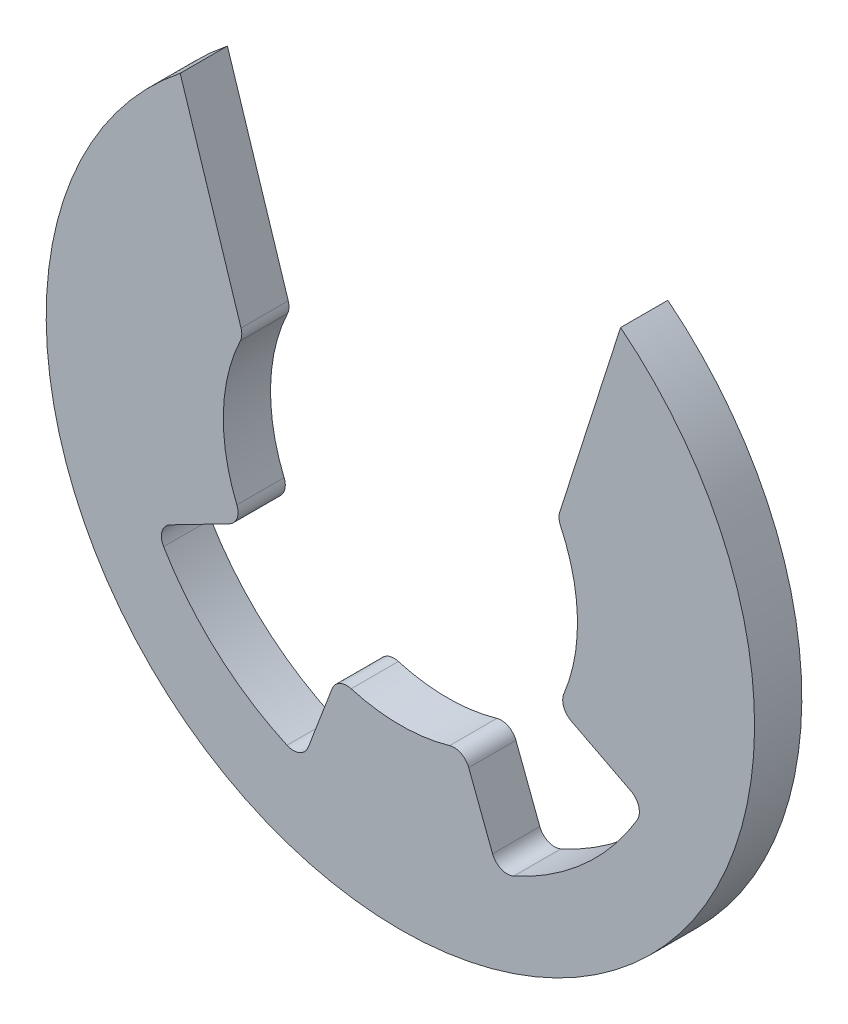
ISO-10303-21;
HEADER;
FILE_DESCRIPTION(('STEP AP214'),'2;1');
FILE_NAME('part.step','',(''),(''),'','','');
FILE_SCHEMA(('AUTOMOTIVE_DESIGN { 1 0 10303 214 1 1 1 1 }'));
ENDSEC;
DATA;
#1=APPLICATION_CONTEXT('core data for automotive mechanical design processes');
#2=APPLICATION_PROTOCOL_DEFINITION('international standard','automotive_design',2000,#1);
#3=PRODUCT_CONTEXT('',#1,'mechanical');
#4=PRODUCT('Part','Part','',(#3));
#5=PRODUCT_RELATED_PRODUCT_CATEGORY('part','',(#4));
#6=PRODUCT_DEFINITION_FORMATION('','',#4);
#7=PRODUCT_DEFINITION_CONTEXT('part definition',#1,'design');
#8=PRODUCT_DEFINITION('design','',#6,#7);
#9=PRODUCT_DEFINITION_SHAPE('','',#8);
#10=(LENGTH_UNIT() NAMED_UNIT(*) SI_UNIT(.MILLI.,.METRE.));
#11=(NAMED_UNIT(*) PLANE_ANGLE_UNIT() SI_UNIT($,.RADIAN.));
#12=(NAMED_UNIT(*) SI_UNIT($,.STERADIAN.) SOLID_ANGLE_UNIT());
#13=UNCERTAINTY_MEASURE_WITH_UNIT(LENGTH_MEASURE(1.E-05),#10,'distance_accuracy_value','');
#14=(GEOMETRIC_REPRESENTATION_CONTEXT(3) GLOBAL_UNCERTAINTY_ASSIGNED_CONTEXT((#13)) GLOBAL_UNIT_ASSIGNED_CONTEXT((#10,
#11,#12)) REPRESENTATION_CONTEXT('',''));
#15=CARTESIAN_POINT('',(0.,0.,0.));
#16=DIRECTION('',(0.,0.,1.));
#17=DIRECTION('',(1.,0.,0.));
#18=AXIS2_PLACEMENT_3D('',#15,#16,#17);
#19=CARTESIAN_POINT('',(2.21510509098527,1.04680916880353,0.6));
#20=DIRECTION('',(0.,0.,-1.));
#21=DIRECTION('',(-1.,0.,0.));
#22=AXIS2_PLACEMENT_3D('',#19,#20,#21);
#23=CYLINDRICAL_SURFACE('',#22,0.2);
#24=CARTESIAN_POINT('',(2.21510509098527,1.04680916880353,0.));
#25=DIRECTION('',(0.,0.,1.));
#26=DIRECTION('',(1.,0.,0.));
#27=AXIS2_PLACEMENT_3D('',#24,#25,#26);
#28=CIRCLE('',#27,0.2);
#29=CARTESIAN_POINT('',(2.02460886438716,1.1077286866273,0.));
#30=VERTEX_POINT('',#29);
#31=CARTESIAN_POINT('',(2.03428018559872,0.961355359105285,0.));
#32=VERTEX_POINT('',#31);
#33=EDGE_CURVE('E217',#30,#32,#28,.T.);
#34=ORIENTED_EDGE('',*,*,#33,.T.);
#35=DIRECTION('',(0.,0.,-1.));
#36=VECTOR('',#35,1.);
#37=CARTESIAN_POINT('',(2.03428018559872,0.961355359105285,0.6));
#38=LINE('',#37,#36);
#39=CARTESIAN_POINT('',(2.03428018559872,0.961355359105285,0.6));
#40=VERTEX_POINT('',#39);
#41=EDGE_CURVE('E11',#40,#32,#38,.T.);
#42=ORIENTED_EDGE('',*,*,#41,.F.);
#43=CARTESIAN_POINT('',(2.21510509098527,1.04680916880353,0.6));
#44=DIRECTION('',(0.,0.,1.));
#45=DIRECTION('',(1.,0.,0.));
#46=AXIS2_PLACEMENT_3D('',#43,#44,#45);
#47=CIRCLE('',#46,0.2);
#48=CARTESIAN_POINT('',(2.02460886438716,1.1077286866273,0.6));
#49=VERTEX_POINT('',#48);
#50=EDGE_CURVE('E259',#49,#40,#47,.T.);
#51=ORIENTED_EDGE('',*,*,#50,.F.);
#52=DIRECTION('',(0.,0.,-1.));
#53=VECTOR('',#52,1.);
#54=CARTESIAN_POINT('',(2.02460886438716,1.1077286866273,0.6));
#55=LINE('',#54,#53);
#56=EDGE_CURVE('E213',#49,#30,#55,.T.);
#57=ORIENTED_EDGE('',*,*,#56,.T.);
#58=EDGE_LOOP('',(#34,#42,#51,#57));
#59=FACE_BOUND('',#58,.T.);
#60=ADVANCED_FACE('F37',(#59),#23,.T.);
#61=CARTESIAN_POINT('',(0.,0.,0.6));
#62=DIRECTION('',(0.,0.,-1.));
#63=DIRECTION('',(-1.,0.,0.));
#64=AXIS2_PLACEMENT_3D('',#61,#62,#63);
#65=CYLINDRICAL_SURFACE('',#64,2.25);
#66=CARTESIAN_POINT('',(0.,0.,0.));
#67=DIRECTION('',(0.,0.,-1.));
#68=DIRECTION('',(1.,0.,0.));
#69=AXIS2_PLACEMENT_3D('',#66,#67,#68);
#70=CIRCLE('',#69,2.25);
#71=CARTESIAN_POINT('',(2.07746998371869,-0.864070869054071,0.));
#72=VERTEX_POINT('',#71);
#73=EDGE_CURVE('E220',#32,#72,#70,.T.);
#74=ORIENTED_EDGE('',*,*,#73,.T.);
#75=DIRECTION('',(0.,0.,-1.));
#76=VECTOR('',#75,1.);
#77=CARTESIAN_POINT('',(2.07746998371869,-0.864070869054071,0.6));
#78=LINE('',#77,#76);
#79=CARTESIAN_POINT('',(2.07746998371869,-0.864070869054071,0.6));
#80=VERTEX_POINT('',#79);
#81=EDGE_CURVE('E45',#80,#72,#78,.T.);
#82=ORIENTED_EDGE('',*,*,#81,.F.);
#83=CARTESIAN_POINT('',(0.,0.,0.6));
#84=DIRECTION('',(0.,0.,-1.));
#85=DIRECTION('',(1.,0.,0.));
#86=AXIS2_PLACEMENT_3D('',#83,#84,#85);
#87=CIRCLE('',#86,2.25);
#88=EDGE_CURVE('E138',#40,#80,#87,.T.);
#89=ORIENTED_EDGE('',*,*,#88,.F.);
#90=ORIENTED_EDGE('',*,*,#41,.T.);
#91=EDGE_LOOP('',(#74,#82,#89,#90));
#92=FACE_BOUND('',#91,.T.);
#93=ADVANCED_FACE('F387',(#92),#65,.F.);
#94=CARTESIAN_POINT('',(2.26213398227146,-0.940877168525544,0.6));
#95=DIRECTION('',(0.,0.,-1.));
#96=DIRECTION('',(-1.,0.,0.));
#97=AXIS2_PLACEMENT_3D('',#94,#95,#96);
#98=CYLINDRICAL_SURFACE('',#97,0.2);
#99=CARTESIAN_POINT('',(2.26213398227146,-0.940877168525544,0.));
#100=DIRECTION('',(0.,0.,1.));
#101=DIRECTION('',(-1.,0.,0.));
#102=AXIS2_PLACEMENT_3D('',#99,#100,#101);
#103=CIRCLE('',#102,0.2);
#104=CARTESIAN_POINT('',(2.17050941281329,-1.11865494630332,0.));
#105=VERTEX_POINT('',#104);
#106=EDGE_CURVE('E222',#72,#105,#103,.T.);
#107=ORIENTED_EDGE('',*,*,#106,.T.);
#108=DIRECTION('',(0.,0.,-1.));
#109=VECTOR('',#108,1.);
#110=CARTESIAN_POINT('',(2.17050941281329,-1.11865494630332,0.6));
#111=LINE('',#110,#109);
#112=CARTESIAN_POINT('',(2.17050941281329,-1.11865494630332,0.6));
#113=VERTEX_POINT('',#112);
#114=EDGE_CURVE('E308',#113,#105,#111,.T.);
#115=ORIENTED_EDGE('',*,*,#114,.F.);
#116=CARTESIAN_POINT('',(2.26213398227146,-0.940877168525544,0.6));
#117=DIRECTION('',(0.,0.,1.));
#118=DIRECTION('',(-1.,0.,0.));
#119=AXIS2_PLACEMENT_3D('',#116,#117,#118);
#120=CIRCLE('',#119,0.2);
#121=EDGE_CURVE('E316',#80,#113,#120,.T.);
#122=ORIENTED_EDGE('',*,*,#121,.F.);
#123=ORIENTED_EDGE('',*,*,#81,.T.);
#124=EDGE_LOOP('',(#107,#115,#122,#123));
#125=FACE_BOUND('',#124,.T.);
#126=ADVANCED_FACE('F314',(#125),#98,.T.);
#127=CARTESIAN_POINT('',(2.17050941281329,-1.11865494630332,0.6));
#128=DIRECTION('',(0.458122847290851,0.888888888888889,0.));
#129=DIRECTION('',(-0.888888888888889,0.458122847290851,0.));
#130=AXIS2_PLACEMENT_3D('',#127,#128,#129);
#131=PLANE('',#130);
#132=DIRECTION('',(0.888888888888889,-0.458122847290851,0.));
#133=VECTOR('',#132,1.);
#134=CARTESIAN_POINT('',(2.17050941281329,-1.11865494630332,0.));
#135=LINE('',#134,#133);
#136=CARTESIAN_POINT('',(2.92794117191122,-1.50902633967309,0.));
#137=VERTEX_POINT('',#136);
#138=EDGE_CURVE('E224',#105,#137,#135,.T.);
#139=ORIENTED_EDGE('',*,*,#138,.T.);
#140=DIRECTION('',(0.,0.,-1.));
#141=VECTOR('',#140,1.);
#142=CARTESIAN_POINT('',(2.92794117191122,-1.50902633967309,0.6));
#143=LINE('',#142,#141);
#144=CARTESIAN_POINT('',(2.92794117191122,-1.50902633967309,0.6));
#145=VERTEX_POINT('',#144);
#146=EDGE_CURVE('E305',#145,#137,#143,.T.);
#147=ORIENTED_EDGE('',*,*,#146,.F.);
#148=DIRECTION('',(0.888888888888889,-0.458122847290851,0.));
#149=VECTOR('',#148,1.);
#150=CARTESIAN_POINT('',(2.17050941281329,-1.11865494630332,0.6));
#151=LINE('',#150,#149);
#152=EDGE_CURVE('E334',#113,#145,#151,.T.);
#153=ORIENTED_EDGE('',*,*,#152,.F.);
#154=ORIENTED_EDGE('',*,*,#114,.T.);
#155=EDGE_LOOP('',(#139,#147,#153,#154));
#156=FACE_BOUND('',#155,.T.);
#157=ADVANCED_FACE('F325',(#156),#131,.F.);
#158=CARTESIAN_POINT('',(2.83631660245305,-1.68680411745087,0.6));
#159=DIRECTION('',(0.,0.,-1.));
#160=DIRECTION('',(-1.,0.,0.));
#161=AXIS2_PLACEMENT_3D('',#158,#159,#160);
#162=CYLINDRICAL_SURFACE('',#161,0.2);
#163=CARTESIAN_POINT('',(2.83631660245305,-1.68680411745087,0.));
#164=DIRECTION('',(0.,0.,-1.));
#165=DIRECTION('',(-1.,0.,0.));
#166=AXIS2_PLACEMENT_3D('',#163,#164,#165);
#167=CIRCLE('',#166,0.2);
#168=CARTESIAN_POINT('',(3.00821457835929,-1.78903467002365,0.));
#169=VERTEX_POINT('',#168);
#170=EDGE_CURVE('E226',#137,#169,#167,.T.);
#171=ORIENTED_EDGE('',*,*,#170,.T.);
#172=DIRECTION('',(0.,0.,-1.));
#173=VECTOR('',#172,1.);
#174=CARTESIAN_POINT('',(3.00821457835929,-1.78903467002365,0.6));
#175=LINE('',#174,#173);
#176=CARTESIAN_POINT('',(3.00821457835929,-1.78903467002365,0.6));
#177=VERTEX_POINT('',#176);
#178=EDGE_CURVE('E302',#177,#169,#175,.T.);
#179=ORIENTED_EDGE('',*,*,#178,.F.);
#180=CARTESIAN_POINT('',(2.83631660245305,-1.68680411745087,0.6));
#181=DIRECTION('',(0.,0.,-1.));
#182=DIRECTION('',(-1.,0.,0.));
#183=AXIS2_PLACEMENT_3D('',#180,#181,#182);
#184=CIRCLE('',#183,0.2);
#185=EDGE_CURVE('E331',#145,#177,#184,.T.);
#186=ORIENTED_EDGE('',*,*,#185,.F.);
#187=ORIENTED_EDGE('',*,*,#146,.T.);
#188=EDGE_LOOP('',(#171,#179,#186,#187));
#189=FACE_BOUND('',#188,.T.);
#190=ADVANCED_FACE('F329',(#189),#162,.F.);
#191=CARTESIAN_POINT('',(0.,0.,0.6));
#192=DIRECTION('',(0.,0.,-1.));
#193=DIRECTION('',(-1.,0.,0.));
#194=AXIS2_PLACEMENT_3D('',#191,#192,#193);
#195=CYLINDRICAL_SURFACE('',#194,3.5);
#196=CARTESIAN_POINT('',(0.,0.,0.));
#197=DIRECTION('',(0.,0.,-1.));
#198=DIRECTION('',(1.,0.,0.));
#199=AXIS2_PLACEMENT_3D('',#196,#197,#198);
#200=CIRCLE('',#199,3.5);
#201=CARTESIAN_POINT('',(1.44041704385956,-3.18985873351139,0.));
#202=VERTEX_POINT('',#201);
#203=EDGE_CURVE('E228',#169,#202,#200,.T.);
#204=ORIENTED_EDGE('',*,*,#203,.T.);
#205=DIRECTION('',(0.,0.,-1.));
#206=VECTOR('',#205,1.);
#207=CARTESIAN_POINT('',(1.44041704385956,-3.18985873351139,0.6));
#208=LINE('',#207,#206);
#209=CARTESIAN_POINT('',(1.44041704385956,-3.18985873351139,0.6));
#210=VERTEX_POINT('',#209);
#211=EDGE_CURVE('E299',#210,#202,#208,.T.);
#212=ORIENTED_EDGE('',*,*,#211,.F.);
#213=CARTESIAN_POINT('',(0.,0.,0.6));
#214=DIRECTION('',(0.,0.,-1.));
#215=DIRECTION('',(1.,0.,0.));
#216=AXIS2_PLACEMENT_3D('',#213,#214,#215);
#217=CIRCLE('',#216,3.5);
#218=EDGE_CURVE('E333',#177,#210,#217,.T.);
#219=ORIENTED_EDGE('',*,*,#218,.F.);
#220=ORIENTED_EDGE('',*,*,#178,.T.);
#221=EDGE_LOOP('',(#204,#212,#219,#220));
#222=FACE_BOUND('',#221,.T.);
#223=ADVANCED_FACE('F400',(#222),#195,.F.);
#224=CARTESIAN_POINT('',(1.35810749849616,-3.00758109159645,0.6));
#225=DIRECTION('',(0.,0.,-1.));
#226=DIRECTION('',(-1.,0.,0.));
#227=AXIS2_PLACEMENT_3D('',#224,#225,#226);
#228=CYLINDRICAL_SURFACE('',#227,0.199999999999999);
#229=CARTESIAN_POINT('',(1.35810749849616,-3.00758109159645,0.));
#230=DIRECTION('',(0.,0.,-1.));
#231=DIRECTION('',(1.,0.,0.));
#232=AXIS2_PLACEMENT_3D('',#229,#230,#231);
#233=CIRCLE('',#232,0.199999999999999);
#234=CARTESIAN_POINT('',(1.17117646876449,-3.07869220270756,0.));
#235=VERTEX_POINT('',#234);
#236=EDGE_CURVE('E230',#202,#235,#233,.T.);
#237=ORIENTED_EDGE('',*,*,#236,.T.);
#238=DIRECTION('',(0.,0.,-1.));
#239=VECTOR('',#238,1.);
#240=CARTESIAN_POINT('',(1.17117646876449,-3.07869220270756,0.6));
#241=LINE('',#240,#239);
#242=CARTESIAN_POINT('',(1.17117646876449,-3.07869220270756,0.6));
#243=VERTEX_POINT('',#242);
#244=EDGE_CURVE('E296',#243,#235,#241,.T.);
#245=ORIENTED_EDGE('',*,*,#244,.F.);
#246=CARTESIAN_POINT('',(1.35810749849616,-3.00758109159645,0.6));
#247=DIRECTION('',(0.,0.,-1.));
#248=DIRECTION('',(1.,0.,0.));
#249=AXIS2_PLACEMENT_3D('',#246,#247,#248);
#250=CIRCLE('',#249,0.199999999999999);
#251=EDGE_CURVE('E336',#210,#243,#250,.T.);
#252=ORIENTED_EDGE('',*,*,#251,.F.);
#253=ORIENTED_EDGE('',*,*,#211,.T.);
#254=EDGE_LOOP('',(#237,#245,#252,#253));
#255=FACE_BOUND('',#254,.T.);
#256=ADVANCED_FACE('F403',(#255),#228,.F.);
#257=CARTESIAN_POINT('',(0.868203765125318,-2.28226252263455,0.6));
#258=DIRECTION('',(-0.93465514865836,-0.355555555555556,0.));
#259=DIRECTION('',(0.355555555555556,-0.93465514865836,0.));
#260=AXIS2_PLACEMENT_3D('',#257,#258,#259);
#261=PLANE('',#260);
#262=DIRECTION('',(-0.355555555555556,0.93465514865836,0.));
#263=VECTOR('',#262,1.);
#264=CARTESIAN_POINT('',(0.868203765125318,-2.28226252263455,0.));
#265=LINE('',#264,#263);
#266=CARTESIAN_POINT('',(0.868203765125318,-2.28226252263455,0.));
#267=VERTEX_POINT('',#266);
#268=EDGE_CURVE('E232',#235,#267,#265,.T.);
#269=ORIENTED_EDGE('',*,*,#268,.T.);
#270=DIRECTION('',(0.,0.,-1.));
#271=VECTOR('',#270,1.);
#272=CARTESIAN_POINT('',(0.868203765125318,-2.28226252263455,0.6));
#273=LINE('',#272,#271);
#274=CARTESIAN_POINT('',(0.868203765125318,-2.28226252263455,0.6));
#275=VERTEX_POINT('',#274);
#276=EDGE_CURVE('E293',#275,#267,#273,.T.);
#277=ORIENTED_EDGE('',*,*,#276,.F.);
#278=DIRECTION('',(-0.355555555555556,0.93465514865836,0.));
#279=VECTOR('',#278,1.);
#280=CARTESIAN_POINT('',(0.868203765125318,-2.28226252263455,0.6));
#281=LINE('',#280,#279);
#282=EDGE_CURVE('E342',#243,#275,#281,.T.);
#283=ORIENTED_EDGE('',*,*,#282,.F.);
#284=ORIENTED_EDGE('',*,*,#244,.T.);
#285=EDGE_LOOP('',(#269,#277,#283,#284));
#286=FACE_BOUND('',#285,.T.);
#287=ADVANCED_FACE('F407',(#286),#261,.F.);
#288=CARTESIAN_POINT('',(0.681272735393646,-2.35337363374566,0.6));
#289=DIRECTION('',(0.,0.,-1.));
#290=DIRECTION('',(-1.,0.,0.));
#291=AXIS2_PLACEMENT_3D('',#288,#289,#290);
#292=CYLINDRICAL_SURFACE('',#291,0.2);
#293=CARTESIAN_POINT('',(0.681272735393646,-2.35337363374566,0.));
#294=DIRECTION('',(0.,0.,1.));
#295=DIRECTION('',(1.,0.,0.));
#296=AXIS2_PLACEMENT_3D('',#293,#294,#295);
#297=CIRCLE('',#296,0.2);
#298=CARTESIAN_POINT('',(0.625658634545184,-2.16126150037867,0.));
#299=VERTEX_POINT('',#298);
#300=EDGE_CURVE('E234',#267,#299,#297,.T.);
#301=ORIENTED_EDGE('',*,*,#300,.T.);
#302=DIRECTION('',(0.,0.,-1.));
#303=VECTOR('',#302,1.);
#304=CARTESIAN_POINT('',(0.625658634545184,-2.16126150037867,0.6));
#305=LINE('',#304,#303);
#306=CARTESIAN_POINT('',(0.625658634545184,-2.16126150037867,0.6));
#307=VERTEX_POINT('',#306);
#308=EDGE_CURVE('E290',#307,#299,#305,.T.);
#309=ORIENTED_EDGE('',*,*,#308,.F.);
#310=CARTESIAN_POINT('',(0.681272735393646,-2.35337363374566,0.6));
#311=DIRECTION('',(0.,0.,1.));
#312=DIRECTION('',(1.,0.,0.));
#313=AXIS2_PLACEMENT_3D('',#310,#311,#312);
#314=CIRCLE('',#313,0.2);
#315=EDGE_CURVE('E344',#275,#307,#314,.T.);
#316=ORIENTED_EDGE('',*,*,#315,.F.);
#317=ORIENTED_EDGE('',*,*,#276,.T.);
#318=EDGE_LOOP('',(#301,#309,#316,#317));
#319=FACE_BOUND('',#318,.T.);
#320=ADVANCED_FACE('F411',(#319),#292,.T.);
#321=CARTESIAN_POINT('',(0.,0.,0.6));
#322=DIRECTION('',(0.,0.,-1.));
#323=DIRECTION('',(-1.,0.,0.));
#324=AXIS2_PLACEMENT_3D('',#321,#322,#323);
#325=CYLINDRICAL_SURFACE('',#324,2.25);
#326=CARTESIAN_POINT('',(0.,0.,0.));
#327=DIRECTION('',(0.,0.,-1.));
#328=DIRECTION('',(1.,0.,0.));
#329=AXIS2_PLACEMENT_3D('',#326,#327,#328);
#330=CIRCLE('',#329,2.25);
#331=CARTESIAN_POINT('',(-0.625658634545185,-2.16126150037867,0.));
#332=VERTEX_POINT('',#331);
#333=EDGE_CURVE('E236',#299,#332,#330,.T.);
#334=ORIENTED_EDGE('',*,*,#333,.T.);
#335=DIRECTION('',(0.,0.,-1.));
#336=VECTOR('',#335,1.);
#337=CARTESIAN_POINT('',(-0.625658634545185,-2.16126150037867,0.6));
#338=LINE('',#337,#336);
#339=CARTESIAN_POINT('',(-0.625658634545185,-2.16126150037867,0.6));
#340=VERTEX_POINT('',#339);
#341=EDGE_CURVE('E287',#340,#332,#338,.T.);
#342=ORIENTED_EDGE('',*,*,#341,.F.);
#343=CARTESIAN_POINT('',(0.,0.,0.6));
#344=DIRECTION('',(0.,0.,-1.));
#345=DIRECTION('',(1.,0.,0.));
#346=AXIS2_PLACEMENT_3D('',#343,#344,#345);
#347=CIRCLE('',#346,2.25);
#348=EDGE_CURVE('E346',#307,#340,#347,.T.);
#349=ORIENTED_EDGE('',*,*,#348,.F.);
#350=ORIENTED_EDGE('',*,*,#308,.T.);
#351=EDGE_LOOP('',(#334,#342,#349,#350));
#352=FACE_BOUND('',#351,.T.);
#353=ADVANCED_FACE('F415',(#352),#325,.F.);
#354=CARTESIAN_POINT('',(-0.681272735393646,-2.35337363374566,0.6));
#355=DIRECTION('',(0.,0.,-1.));
#356=DIRECTION('',(-1.,0.,0.));
#357=AXIS2_PLACEMENT_3D('',#354,#355,#356);
#358=CYLINDRICAL_SURFACE('',#357,0.2);
#359=CARTESIAN_POINT('',(-0.681272735393646,-2.35337363374566,0.));
#360=DIRECTION('',(0.,0.,1.));
#361=DIRECTION('',(-1.,0.,0.));
#362=AXIS2_PLACEMENT_3D('',#359,#360,#361);
#363=CIRCLE('',#362,0.2);
#364=CARTESIAN_POINT('',(-0.868203765125318,-2.28226252263455,0.));
#365=VERTEX_POINT('',#364);
#366=EDGE_CURVE('E238',#332,#365,#363,.T.);
#367=ORIENTED_EDGE('',*,*,#366,.T.);
#368=DIRECTION('',(0.,0.,-1.));
#369=VECTOR('',#368,1.);
#370=CARTESIAN_POINT('',(-0.868203765125318,-2.28226252263455,0.6));
#371=LINE('',#370,#369);
#372=CARTESIAN_POINT('',(-0.868203765125318,-2.28226252263455,0.6));
#373=VERTEX_POINT('',#372);
#374=EDGE_CURVE('E284',#373,#365,#371,.T.);
#375=ORIENTED_EDGE('',*,*,#374,.F.);
#376=CARTESIAN_POINT('',(-0.681272735393646,-2.35337363374566,0.6));
#377=DIRECTION('',(0.,0.,1.));
#378=DIRECTION('',(-1.,0.,0.));
#379=AXIS2_PLACEMENT_3D('',#376,#377,#378);
#380=CIRCLE('',#379,0.2);
#381=EDGE_CURVE('E348',#340,#373,#380,.T.);
#382=ORIENTED_EDGE('',*,*,#381,.F.);
#383=ORIENTED_EDGE('',*,*,#341,.T.);
#384=EDGE_LOOP('',(#367,#375,#382,#383));
#385=FACE_BOUND('',#384,.T.);
#386=ADVANCED_FACE('F419',(#385),#358,.T.);
#387=CARTESIAN_POINT('',(-0.868203765125318,-2.28226252263455,0.6));
#388=DIRECTION('',(0.93465514865836,-0.355555555555556,0.));
#389=DIRECTION('',(0.355555555555556,0.93465514865836,0.));
#390=AXIS2_PLACEMENT_3D('',#387,#388,#389);
#391=PLANE('',#390);
#392=DIRECTION('',(-0.355555555555556,-0.93465514865836,0.));
#393=VECTOR('',#392,1.);
#394=CARTESIAN_POINT('',(-0.868203765125318,-2.28226252263455,0.));
#395=LINE('',#394,#393);
#396=CARTESIAN_POINT('',(-1.17117646876449,-3.07869220270756,0.));
#397=VERTEX_POINT('',#396);
#398=EDGE_CURVE('E240',#365,#397,#395,.T.);
#399=ORIENTED_EDGE('',*,*,#398,.T.);
#400=DIRECTION('',(0.,0.,-1.));
#401=VECTOR('',#400,1.);
#402=CARTESIAN_POINT('',(-1.17117646876449,-3.07869220270756,0.6));
#403=LINE('',#402,#401);
#404=CARTESIAN_POINT('',(-1.17117646876449,-3.07869220270756,0.6));
#405=VERTEX_POINT('',#404);
#406=EDGE_CURVE('E281',#405,#397,#403,.T.);
#407=ORIENTED_EDGE('',*,*,#406,.F.);
#408=DIRECTION('',(-0.355555555555556,-0.93465514865836,0.));
#409=VECTOR('',#408,1.);
#410=CARTESIAN_POINT('',(-0.868203765125318,-2.28226252263455,0.6));
#411=LINE('',#410,#409);
#412=EDGE_CURVE('E350',#373,#405,#411,.T.);
#413=ORIENTED_EDGE('',*,*,#412,.F.);
#414=ORIENTED_EDGE('',*,*,#374,.T.);
#415=EDGE_LOOP('',(#399,#407,#413,#414));
#416=FACE_BOUND('',#415,.T.);
#417=ADVANCED_FACE('F423',(#416),#391,.F.);
#418=CARTESIAN_POINT('',(-1.35810749849616,-3.00758109159645,0.6));
#419=DIRECTION('',(0.,0.,-1.));
#420=DIRECTION('',(-1.,0.,0.));
#421=AXIS2_PLACEMENT_3D('',#418,#419,#420);
#422=CYLINDRICAL_SURFACE('',#421,0.199999999999999);
#423=CARTESIAN_POINT('',(-1.35810749849616,-3.00758109159645,0.));
#424=DIRECTION('',(0.,0.,-1.));
#425=DIRECTION('',(-1.,0.,0.));
#426=AXIS2_PLACEMENT_3D('',#423,#424,#425);
#427=CIRCLE('',#426,0.199999999999999);
#428=CARTESIAN_POINT('',(-1.44041704385956,-3.18985873351139,0.));
#429=VERTEX_POINT('',#428);
#430=EDGE_CURVE('E242',#397,#429,#427,.T.);
#431=ORIENTED_EDGE('',*,*,#430,.T.);
#432=DIRECTION('',(0.,0.,-1.));
#433=VECTOR('',#432,1.);
#434=CARTESIAN_POINT('',(-1.44041704385956,-3.18985873351139,0.6));
#435=LINE('',#434,#433);
#436=CARTESIAN_POINT('',(-1.44041704385956,-3.18985873351139,0.6));
#437=VERTEX_POINT('',#436);
#438=EDGE_CURVE('E278',#437,#429,#435,.T.);
#439=ORIENTED_EDGE('',*,*,#438,.F.);
#440=CARTESIAN_POINT('',(-1.35810749849616,-3.00758109159645,0.6));
#441=DIRECTION('',(0.,0.,-1.));
#442=DIRECTION('',(-1.,0.,0.));
#443=AXIS2_PLACEMENT_3D('',#440,#441,#442);
#444=CIRCLE('',#443,0.199999999999999);
#445=EDGE_CURVE('E352',#405,#437,#444,.T.);
#446=ORIENTED_EDGE('',*,*,#445,.F.);
#447=ORIENTED_EDGE('',*,*,#406,.T.);
#448=EDGE_LOOP('',(#431,#439,#446,#447));
#449=FACE_BOUND('',#448,.T.);
#450=ADVANCED_FACE('F427',(#449),#422,.F.);
#451=CARTESIAN_POINT('',(0.,0.,0.6));
#452=DIRECTION('',(0.,0.,-1.));
#453=DIRECTION('',(-1.,0.,0.));
#454=AXIS2_PLACEMENT_3D('',#451,#452,#453);
#455=CYLINDRICAL_SURFACE('',#454,3.5);
#456=CARTESIAN_POINT('',(0.,0.,0.));
#457=DIRECTION('',(0.,0.,-1.));
#458=DIRECTION('',(-1.,0.,0.));
#459=AXIS2_PLACEMENT_3D('',#456,#457,#458);
#460=CIRCLE('',#459,3.5);
#461=CARTESIAN_POINT('',(-3.00821457835929,-1.78903467002365,0.));
#462=VERTEX_POINT('',#461);
#463=EDGE_CURVE('E244',#429,#462,#460,.T.);
#464=ORIENTED_EDGE('',*,*,#463,.T.);
#465=DIRECTION('',(0.,0.,-1.));
#466=VECTOR('',#465,1.);
#467=CARTESIAN_POINT('',(-3.00821457835929,-1.78903467002365,0.6));
#468=LINE('',#467,#466);
#469=CARTESIAN_POINT('',(-3.00821457835929,-1.78903467002365,0.6));
#470=VERTEX_POINT('',#469);
#471=EDGE_CURVE('E275',#470,#462,#468,.T.);
#472=ORIENTED_EDGE('',*,*,#471,.F.);
#473=CARTESIAN_POINT('',(0.,0.,0.6));
#474=DIRECTION('',(0.,0.,-1.));
#475=DIRECTION('',(-1.,0.,0.));
#476=AXIS2_PLACEMENT_3D('',#473,#474,#475);
#477=CIRCLE('',#476,3.5);
#478=EDGE_CURVE('E354',#437,#470,#477,.T.);
#479=ORIENTED_EDGE('',*,*,#478,.F.);
#480=ORIENTED_EDGE('',*,*,#438,.T.);
#481=EDGE_LOOP('',(#464,#472,#479,#480));
#482=FACE_BOUND('',#481,.T.);
#483=ADVANCED_FACE('F431',(#482),#455,.F.);
#484=CARTESIAN_POINT('',(-2.83631660245305,-1.68680411745087,0.6));
#485=DIRECTION('',(0.,0.,-1.));
#486=DIRECTION('',(-1.,0.,0.));
#487=AXIS2_PLACEMENT_3D('',#484,#485,#486);
#488=CYLINDRICAL_SURFACE('',#487,0.2);
#489=CARTESIAN_POINT('',(-2.83631660245305,-1.68680411745087,0.));
#490=DIRECTION('',(0.,0.,-1.));
#491=DIRECTION('',(1.,0.,0.));
#492=AXIS2_PLACEMENT_3D('',#489,#490,#491);
#493=CIRCLE('',#492,0.2);
#494=CARTESIAN_POINT('',(-2.92794117191122,-1.50902633967309,0.));
#495=VERTEX_POINT('',#494);
#496=EDGE_CURVE('E246',#462,#495,#493,.T.);
#497=ORIENTED_EDGE('',*,*,#496,.T.);
#498=DIRECTION('',(0.,0.,-1.));
#499=VECTOR('',#498,1.);
#500=CARTESIAN_POINT('',(-2.92794117191122,-1.50902633967309,0.6));
#501=LINE('',#500,#499);
#502=CARTESIAN_POINT('',(-2.92794117191122,-1.50902633967309,0.6));
#503=VERTEX_POINT('',#502);
#504=EDGE_CURVE('E272',#503,#495,#501,.T.);
#505=ORIENTED_EDGE('',*,*,#504,.F.);
#506=CARTESIAN_POINT('',(-2.83631660245305,-1.68680411745087,0.6));
#507=DIRECTION('',(0.,0.,-1.));
#508=DIRECTION('',(1.,0.,0.));
#509=AXIS2_PLACEMENT_3D('',#506,#507,#508);
#510=CIRCLE('',#509,0.2);
#511=EDGE_CURVE('E356',#470,#503,#510,.T.);
#512=ORIENTED_EDGE('',*,*,#511,.F.);
#513=ORIENTED_EDGE('',*,*,#471,.T.);
#514=EDGE_LOOP('',(#497,#505,#512,#513));
#515=FACE_BOUND('',#514,.T.);
#516=ADVANCED_FACE('F435',(#515),#488,.F.);
#517=CARTESIAN_POINT('',(-2.17050941281329,-1.11865494630332,0.6));
#518=DIRECTION('',(-0.458122847290851,0.888888888888889,0.));
#519=DIRECTION('',(-0.888888888888889,-0.458122847290851,0.));
#520=AXIS2_PLACEMENT_3D('',#517,#518,#519);
#521=PLANE('',#520);
#522=DIRECTION('',(0.888888888888889,0.458122847290851,0.));
#523=VECTOR('',#522,1.);
#524=CARTESIAN_POINT('',(-2.17050941281329,-1.11865494630332,0.));
#525=LINE('',#524,#523);
#526=CARTESIAN_POINT('',(-2.17050941281329,-1.11865494630332,0.));
#527=VERTEX_POINT('',#526);
#528=EDGE_CURVE('E248',#495,#527,#525,.T.);
#529=ORIENTED_EDGE('',*,*,#528,.T.);
#530=DIRECTION('',(0.,0.,-1.));
#531=VECTOR('',#530,1.);
#532=CARTESIAN_POINT('',(-2.17050941281329,-1.11865494630332,0.6));
#533=LINE('',#532,#531);
#534=CARTESIAN_POINT('',(-2.17050941281329,-1.11865494630332,0.6));
#535=VERTEX_POINT('',#534);
#536=EDGE_CURVE('E269',#535,#527,#533,.T.);
#537=ORIENTED_EDGE('',*,*,#536,.F.);
#538=DIRECTION('',(0.888888888888889,0.458122847290851,0.));
#539=VECTOR('',#538,1.);
#540=CARTESIAN_POINT('',(-2.17050941281329,-1.11865494630332,0.6));
#541=LINE('',#540,#539);
#542=EDGE_CURVE('E358',#503,#535,#541,.T.);
#543=ORIENTED_EDGE('',*,*,#542,.F.);
#544=ORIENTED_EDGE('',*,*,#504,.T.);
#545=EDGE_LOOP('',(#529,#537,#543,#544));
#546=FACE_BOUND('',#545,.T.);
#547=ADVANCED_FACE('F439',(#546),#521,.F.);
#548=CARTESIAN_POINT('',(-2.26213398227146,-0.940877168525544,0.6));
#549=DIRECTION('',(0.,0.,-1.));
#550=DIRECTION('',(-1.,0.,0.));
#551=AXIS2_PLACEMENT_3D('',#548,#549,#550);
#552=CYLINDRICAL_SURFACE('',#551,0.2);
#553=CARTESIAN_POINT('',(-2.26213398227146,-0.940877168525544,0.));
#554=DIRECTION('',(0.,0.,1.));
#555=DIRECTION('',(1.,0.,0.));
#556=AXIS2_PLACEMENT_3D('',#553,#554,#555);
#557=CIRCLE('',#556,0.2);
#558=CARTESIAN_POINT('',(-2.07746998371869,-0.864070869054071,0.));
#559=VERTEX_POINT('',#558);
#560=EDGE_CURVE('E250',#527,#559,#557,.T.);
#561=ORIENTED_EDGE('',*,*,#560,.T.);
#562=DIRECTION('',(0.,0.,-1.));
#563=VECTOR('',#562,1.);
#564=CARTESIAN_POINT('',(-2.07746998371869,-0.864070869054071,0.6));
#565=LINE('',#564,#563);
#566=CARTESIAN_POINT('',(-2.07746998371869,-0.864070869054071,0.6));
#567=VERTEX_POINT('',#566);
#568=EDGE_CURVE('E266',#567,#559,#565,.T.);
#569=ORIENTED_EDGE('',*,*,#568,.F.);
#570=CARTESIAN_POINT('',(-2.26213398227146,-0.940877168525544,0.6));
#571=DIRECTION('',(0.,0.,1.));
#572=DIRECTION('',(1.,0.,0.));
#573=AXIS2_PLACEMENT_3D('',#570,#571,#572);
#574=CIRCLE('',#573,0.2);
#575=EDGE_CURVE('E360',#535,#567,#574,.T.);
#576=ORIENTED_EDGE('',*,*,#575,.F.);
#577=ORIENTED_EDGE('',*,*,#536,.T.);
#578=EDGE_LOOP('',(#561,#569,#576,#577));
#579=FACE_BOUND('',#578,.T.);
#580=ADVANCED_FACE('F443',(#579),#552,.T.);
#581=CARTESIAN_POINT('',(0.,0.,0.6));
#582=DIRECTION('',(0.,0.,-1.));
#583=DIRECTION('',(-1.,0.,0.));
#584=AXIS2_PLACEMENT_3D('',#581,#582,#583);
#585=CYLINDRICAL_SURFACE('',#584,2.25);
#586=CARTESIAN_POINT('',(0.,0.,0.));
#587=DIRECTION('',(0.,0.,-1.));
#588=DIRECTION('',(-1.,0.,0.));
#589=AXIS2_PLACEMENT_3D('',#586,#587,#588);
#590=CIRCLE('',#589,2.25);
#591=CARTESIAN_POINT('',(-2.03428018559872,0.961355359105284,0.));
#592=VERTEX_POINT('',#591);
#593=EDGE_CURVE('E252',#559,#592,#590,.T.);
#594=ORIENTED_EDGE('',*,*,#593,.T.);
#595=DIRECTION('',(0.,0.,-1.));
#596=VECTOR('',#595,1.);
#597=CARTESIAN_POINT('',(-2.03428018559872,0.961355359105284,0.6));
#598=LINE('',#597,#596);
#599=CARTESIAN_POINT('',(-2.03428018559872,0.961355359105284,0.6));
#600=VERTEX_POINT('',#599);
#601=EDGE_CURVE('E263',#600,#592,#598,.T.);
#602=ORIENTED_EDGE('',*,*,#601,.F.);
#603=CARTESIAN_POINT('',(0.,0.,0.6));
#604=DIRECTION('',(0.,0.,-1.));
#605=DIRECTION('',(-1.,0.,0.));
#606=AXIS2_PLACEMENT_3D('',#603,#604,#605);
#607=CIRCLE('',#606,2.25);
#608=EDGE_CURVE('E362',#567,#600,#607,.T.);
#609=ORIENTED_EDGE('',*,*,#608,.F.);
#610=ORIENTED_EDGE('',*,*,#568,.T.);
#611=EDGE_LOOP('',(#594,#602,#609,#610));
#612=FACE_BOUND('',#611,.T.);
#613=ADVANCED_FACE('F368',(#612),#585,.F.);
#614=CARTESIAN_POINT('',(-2.21510509098527,1.04680916880353,0.6));
#615=DIRECTION('',(0.,0.,-1.));
#616=DIRECTION('',(-1.,0.,0.));
#617=AXIS2_PLACEMENT_3D('',#614,#615,#616);
#618=CYLINDRICAL_SURFACE('',#617,0.2);
#619=CARTESIAN_POINT('',(-2.21510509098527,1.04680916880353,0.));
#620=DIRECTION('',(0.,0.,1.));
#621=DIRECTION('',(-1.,0.,0.));
#622=AXIS2_PLACEMENT_3D('',#619,#620,#621);
#623=CIRCLE('',#622,0.2);
#624=CARTESIAN_POINT('',(-2.02460886438716,1.1077286866273,0.));
#625=VERTEX_POINT('',#624);
#626=EDGE_CURVE('E254',#592,#625,#623,.T.);
#627=ORIENTED_EDGE('',*,*,#626,.T.);
#628=DIRECTION('',(0.,0.,-1.));
#629=VECTOR('',#628,1.);
#630=CARTESIAN_POINT('',(-2.02460886438716,1.1077286866273,0.6));
#631=LINE('',#630,#629);
#632=CARTESIAN_POINT('',(-2.02460886438716,1.1077286866273,0.6));
#633=VERTEX_POINT('',#632);
#634=EDGE_CURVE('E208',#633,#625,#631,.T.);
#635=ORIENTED_EDGE('',*,*,#634,.F.);
#636=CARTESIAN_POINT('',(-2.21510509098527,1.04680916880353,0.6));
#637=DIRECTION('',(0.,0.,1.));
#638=DIRECTION('',(-1.,0.,0.));
#639=AXIS2_PLACEMENT_3D('',#636,#637,#638);
#640=CIRCLE('',#639,0.2);
#641=EDGE_CURVE('E199',#600,#633,#640,.T.);
#642=ORIENTED_EDGE('',*,*,#641,.F.);
#643=ORIENTED_EDGE('',*,*,#601,.T.);
#644=EDGE_LOOP('',(#627,#635,#642,#643));
#645=FACE_BOUND('',#644,.T.);
#646=ADVANCED_FACE('F372',(#645),#618,.T.);
#647=CARTESIAN_POINT('',(-2.79755049993734,3.52472852859626,0.6));
#648=DIRECTION('',(-0.952481132990558,-0.304597589118861,0.));
#649=DIRECTION('',(0.304597589118861,-0.952481132990558,0.));
#650=AXIS2_PLACEMENT_3D('',#647,#648,#649);
#651=PLANE('',#650);
#652=DIRECTION('',(-0.304597589118861,0.952481132990558,0.));
#653=VECTOR('',#652,1.);
#654=CARTESIAN_POINT('',(-2.79755049993734,3.52472852859626,0.));
#655=LINE('',#654,#653);
#656=CARTESIAN_POINT('',(-2.79755049993734,3.52472852859626,0.));
#657=VERTEX_POINT('',#656);
#658=EDGE_CURVE('E207',#625,#657,#655,.T.);
#659=ORIENTED_EDGE('',*,*,#658,.T.);
#660=DIRECTION('',(0.,0.,-1.));
#661=VECTOR('',#660,1.);
#662=CARTESIAN_POINT('',(-2.79755049993734,3.52472852859626,0.6));
#663=LINE('',#662,#661);
#664=CARTESIAN_POINT('',(-2.79755049993734,3.52472852859626,0.6));
#665=VERTEX_POINT('',#664);
#666=EDGE_CURVE('E204',#665,#657,#663,.T.);
#667=ORIENTED_EDGE('',*,*,#666,.F.);
#668=DIRECTION('',(-0.304597589118861,0.952481132990558,0.));
#669=VECTOR('',#668,1.);
#670=CARTESIAN_POINT('',(-2.79755049993734,3.52472852859626,0.6));
#671=LINE('',#670,#669);
#672=EDGE_CURVE('E193',#633,#665,#671,.T.);
#673=ORIENTED_EDGE('',*,*,#672,.F.);
#674=ORIENTED_EDGE('',*,*,#634,.T.);
#675=EDGE_LOOP('',(#659,#667,#673,#674));
#676=FACE_BOUND('',#675,.T.);
#677=ADVANCED_FACE('F205',(#676),#651,.F.);
#678=CARTESIAN_POINT('',(0.,0.,0.6));
#679=DIRECTION('',(0.,0.,-1.));
#680=DIRECTION('',(-1.,0.,0.));
#681=AXIS2_PLACEMENT_3D('',#678,#679,#680);
#682=CYLINDRICAL_SURFACE('',#681,4.5);
#683=CARTESIAN_POINT('',(0.,0.,0.));
#684=DIRECTION('',(0.,0.,1.));
#685=DIRECTION('',(1.,0.,0.));
#686=AXIS2_PLACEMENT_3D('',#683,#684,#685);
#687=CIRCLE('',#686,4.5);
#688=CARTESIAN_POINT('',(2.79755049993734,3.52472852859626,0.));
#689=VERTEX_POINT('',#688);
#690=EDGE_CURVE('E124',#657,#689,#687,.T.);
#691=ORIENTED_EDGE('',*,*,#690,.T.);
#692=DIRECTION('',(0.,0.,-1.));
#693=VECTOR('',#692,1.);
#694=CARTESIAN_POINT('',(2.79755049993734,3.52472852859626,0.6));
#695=LINE('',#694,#693);
#696=CARTESIAN_POINT('',(2.79755049993734,3.52472852859626,0.6));
#697=VERTEX_POINT('',#696);
#698=EDGE_CURVE('E209',#697,#689,#695,.T.);
#699=ORIENTED_EDGE('',*,*,#698,.F.);
#700=CARTESIAN_POINT('',(0.,0.,0.6));
#701=DIRECTION('',(0.,0.,1.));
#702=DIRECTION('',(1.,0.,0.));
#703=AXIS2_PLACEMENT_3D('',#700,#701,#702);
#704=CIRCLE('',#703,4.5);
#705=EDGE_CURVE('E197',#665,#697,#704,.T.);
#706=ORIENTED_EDGE('',*,*,#705,.F.);
#707=ORIENTED_EDGE('',*,*,#666,.T.);
#708=EDGE_LOOP('',(#691,#699,#706,#707));
#709=FACE_BOUND('',#708,.T.);
#710=ADVANCED_FACE('F211',(#709),#682,.T.);
#711=CARTESIAN_POINT('',(2.79755049993734,3.52472852859626,0.6));
#712=DIRECTION('',(0.952481132990558,-0.304597589118861,0.));
#713=DIRECTION('',(0.304597589118861,0.952481132990558,0.));
#714=AXIS2_PLACEMENT_3D('',#711,#712,#713);
#715=PLANE('',#714);
#716=DIRECTION('',(-0.304597589118861,-0.952481132990558,0.));
#717=VECTOR('',#716,1.);
#718=CARTESIAN_POINT('',(2.79755049993734,3.52472852859626,0.));
#719=LINE('',#718,#717);
#720=EDGE_CURVE('E130',#689,#30,#719,.T.);
#721=ORIENTED_EDGE('',*,*,#720,.T.);
#722=ORIENTED_EDGE('',*,*,#56,.F.);
#723=DIRECTION('',(-0.304597589118861,-0.952481132990558,0.));
#724=VECTOR('',#723,1.);
#725=CARTESIAN_POINT('',(2.79755049993734,3.52472852859626,0.6));
#726=LINE('',#725,#724);
#727=EDGE_CURVE('E53',#697,#49,#726,.T.);
#728=ORIENTED_EDGE('',*,*,#727,.F.);
#729=ORIENTED_EDGE('',*,*,#698,.T.);
#730=EDGE_LOOP('',(#721,#722,#728,#729));
#731=FACE_BOUND('',#730,.T.);
#732=ADVANCED_FACE('F376',(#731),#715,.F.);
#733=CARTESIAN_POINT('',(2.21510509098527,1.04680916880353,0.6));
#734=DIRECTION('',(0.,0.,1.));
#735=DIRECTION('',(1.,0.,0.));
#736=AXIS2_PLACEMENT_3D('',#733,#734,#735);
#737=PLANE('',#736);
#738=ORIENTED_EDGE('',*,*,#50,.T.);
#739=ORIENTED_EDGE('',*,*,#88,.T.);
#740=ORIENTED_EDGE('',*,*,#121,.T.);
#741=ORIENTED_EDGE('',*,*,#152,.T.);
#742=ORIENTED_EDGE('',*,*,#185,.T.);
#743=ORIENTED_EDGE('',*,*,#218,.T.);
#744=ORIENTED_EDGE('',*,*,#251,.T.);
#745=ORIENTED_EDGE('',*,*,#282,.T.);
#746=ORIENTED_EDGE('',*,*,#315,.T.);
#747=ORIENTED_EDGE('',*,*,#348,.T.);
#748=ORIENTED_EDGE('',*,*,#381,.T.);
#749=ORIENTED_EDGE('',*,*,#412,.T.);
#750=ORIENTED_EDGE('',*,*,#445,.T.);
#751=ORIENTED_EDGE('',*,*,#478,.T.);
#752=ORIENTED_EDGE('',*,*,#511,.T.);
#753=ORIENTED_EDGE('',*,*,#542,.T.);
#754=ORIENTED_EDGE('',*,*,#575,.T.);
#755=ORIENTED_EDGE('',*,*,#608,.T.);
#756=ORIENTED_EDGE('',*,*,#641,.T.);
#757=ORIENTED_EDGE('',*,*,#672,.T.);
#758=ORIENTED_EDGE('',*,*,#705,.T.);
#759=ORIENTED_EDGE('',*,*,#727,.T.);
#760=EDGE_LOOP('',(#738,#739,#740,#741,#742,#743,#744,#745,#746,#747,#748,#749,#750,#751,#752,
#753,#754,#755,#756,#757,#758,#759));
#761=FACE_BOUND('',#760,.T.);
#762=ADVANCED_FACE('F195',(#761),#737,.T.);
#763=CARTESIAN_POINT('',(2.21510509098527,1.04680916880353,0.));
#764=DIRECTION('',(0.,0.,1.));
#765=DIRECTION('',(1.,0.,0.));
#766=AXIS2_PLACEMENT_3D('',#763,#764,#765);
#767=PLANE('',#766);
#768=ORIENTED_EDGE('',*,*,#33,.F.);
#769=ORIENTED_EDGE('',*,*,#720,.F.);
#770=ORIENTED_EDGE('',*,*,#690,.F.);
#771=ORIENTED_EDGE('',*,*,#658,.F.);
#772=ORIENTED_EDGE('',*,*,#626,.F.);
#773=ORIENTED_EDGE('',*,*,#593,.F.);
#774=ORIENTED_EDGE('',*,*,#560,.F.);
#775=ORIENTED_EDGE('',*,*,#528,.F.);
#776=ORIENTED_EDGE('',*,*,#496,.F.);
#777=ORIENTED_EDGE('',*,*,#463,.F.);
#778=ORIENTED_EDGE('',*,*,#430,.F.);
#779=ORIENTED_EDGE('',*,*,#398,.F.);
#780=ORIENTED_EDGE('',*,*,#366,.F.);
#781=ORIENTED_EDGE('',*,*,#333,.F.);
#782=ORIENTED_EDGE('',*,*,#300,.F.);
#783=ORIENTED_EDGE('',*,*,#268,.F.);
#784=ORIENTED_EDGE('',*,*,#236,.F.);
#785=ORIENTED_EDGE('',*,*,#203,.F.);
#786=ORIENTED_EDGE('',*,*,#170,.F.);
#787=ORIENTED_EDGE('',*,*,#138,.F.);
#788=ORIENTED_EDGE('',*,*,#106,.F.);
#789=ORIENTED_EDGE('',*,*,#73,.F.);
#790=EDGE_LOOP('',(#768,#769,#770,#771,#772,#773,#774,#775,#776,#777,#778,#779,#780,#781,#782,
#783,#784,#785,#786,#787,#788,#789));
#791=FACE_BOUND('',#790,.T.);
#792=ADVANCED_FACE('F320',(#791),#767,.F.);
#793=CLOSED_SHELL('',(#60,#93,#126,#157,#190,#223,#256,#287,#320,#353,#386,#417,#450,#483,#516,
#547,#580,#613,#646,#677,#710,#732,#762,#792));
#794=MANIFOLD_SOLID_BREP('B2',#793);
#795=ADVANCED_BREP_SHAPE_REPRESENTATION('',(#18,#794),#14);
#796=SHAPE_DEFINITION_REPRESENTATION(#9,#795);
ENDSEC;
END-ISO-10303-21;
